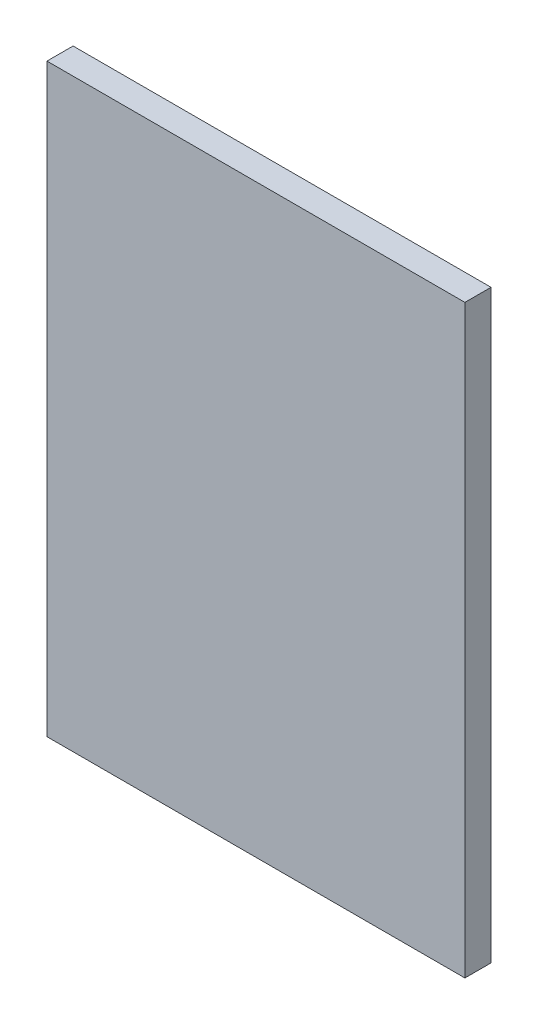
ISO-10303-21;
HEADER;
FILE_DESCRIPTION(('STEP AP214'),'2;1');
FILE_NAME('part.step','',(''),(''),'','','');
FILE_SCHEMA(('AUTOMOTIVE_DESIGN { 1 0 10303 214 1 1 1 1 }'));
ENDSEC;
DATA;
#1=APPLICATION_CONTEXT('core data for automotive mechanical design processes');
#2=APPLICATION_PROTOCOL_DEFINITION('international standard','automotive_design',2000,#1);
#3=PRODUCT_CONTEXT('',#1,'mechanical');
#4=PRODUCT('Part','Part','',(#3));
#5=PRODUCT_RELATED_PRODUCT_CATEGORY('part','',(#4));
#6=PRODUCT_DEFINITION_FORMATION('','',#4);
#7=PRODUCT_DEFINITION_CONTEXT('part definition',#1,'design');
#8=PRODUCT_DEFINITION('design','',#6,#7);
#9=PRODUCT_DEFINITION_SHAPE('','',#8);
#10=(LENGTH_UNIT() NAMED_UNIT(*) SI_UNIT(.MILLI.,.METRE.));
#11=(NAMED_UNIT(*) PLANE_ANGLE_UNIT() SI_UNIT($,.RADIAN.));
#12=(NAMED_UNIT(*) SI_UNIT($,.STERADIAN.) SOLID_ANGLE_UNIT());
#13=UNCERTAINTY_MEASURE_WITH_UNIT(LENGTH_MEASURE(1.E-05),#10,'distance_accuracy_value','');
#14=(GEOMETRIC_REPRESENTATION_CONTEXT(3) GLOBAL_UNCERTAINTY_ASSIGNED_CONTEXT((#13)) GLOBAL_UNIT_ASSIGNED_CONTEXT((#10,
#11,#12)) REPRESENTATION_CONTEXT('',''));
#15=CARTESIAN_POINT('',(0.,0.,0.));
#16=DIRECTION('',(0.,0.,1.));
#17=DIRECTION('',(1.,0.,0.));
#18=AXIS2_PLACEMENT_3D('',#15,#16,#17);
#19=CARTESIAN_POINT('',(-25.4,-35.56,3.175));
#20=DIRECTION('',(1.,0.,0.));
#21=DIRECTION('',(0.,0.,-1.));
#22=AXIS2_PLACEMENT_3D('',#19,#20,#21);
#23=PLANE('',#22);
#24=DIRECTION('',(0.,-1.,0.));
#25=VECTOR('',#24,1.);
#26=CARTESIAN_POINT('',(-25.4,-35.56,0.));
#27=LINE('',#26,#25);
#28=CARTESIAN_POINT('',(-25.4,35.56,0.));
#29=VERTEX_POINT('',#28);
#30=CARTESIAN_POINT('',(-25.4,-35.56,0.));
#31=VERTEX_POINT('',#30);
#32=EDGE_CURVE('E107',#29,#31,#27,.T.);
#33=ORIENTED_EDGE('',*,*,#32,.T.);
#34=DIRECTION('',(0.,0.,-1.));
#35=VECTOR('',#34,1.);
#36=CARTESIAN_POINT('',(-25.4,-35.56,3.175));
#37=LINE('',#36,#35);
#38=CARTESIAN_POINT('',(-25.4,-35.56,3.175));
#39=VERTEX_POINT('',#38);
#40=EDGE_CURVE('E11',#39,#31,#37,.T.);
#41=ORIENTED_EDGE('',*,*,#40,.F.);
#42=DIRECTION('',(0.,-1.,0.));
#43=VECTOR('',#42,1.);
#44=CARTESIAN_POINT('',(-25.4,-35.56,3.175));
#45=LINE('',#44,#43);
#46=CARTESIAN_POINT('',(-25.4,35.56,3.175));
#47=VERTEX_POINT('',#46);
#48=EDGE_CURVE('E91',#47,#39,#45,.T.);
#49=ORIENTED_EDGE('',*,*,#48,.F.);
#50=DIRECTION('',(0.,0.,-1.));
#51=VECTOR('',#50,1.);
#52=CARTESIAN_POINT('',(-25.4,35.56,3.175));
#53=LINE('',#52,#51);
#54=EDGE_CURVE('E103',#47,#29,#53,.T.);
#55=ORIENTED_EDGE('',*,*,#54,.T.);
#56=EDGE_LOOP('',(#33,#41,#49,#55));
#57=FACE_BOUND('',#56,.T.);
#58=ADVANCED_FACE('F39',(#57),#23,.F.);
#59=CARTESIAN_POINT('',(25.4,-35.56,3.175));
#60=DIRECTION('',(0.,1.,0.));
#61=DIRECTION('',(-1.,0.,0.));
#62=AXIS2_PLACEMENT_3D('',#59,#60,#61);
#63=PLANE('',#62);
#64=DIRECTION('',(1.,0.,0.));
#65=VECTOR('',#64,1.);
#66=CARTESIAN_POINT('',(25.4,-35.56,0.));
#67=LINE('',#66,#65);
#68=CARTESIAN_POINT('',(25.4,-35.56,0.));
#69=VERTEX_POINT('',#68);
#70=EDGE_CURVE('E96',#31,#69,#67,.T.);
#71=ORIENTED_EDGE('',*,*,#70,.T.);
#72=DIRECTION('',(0.,0.,-1.));
#73=VECTOR('',#72,1.);
#74=CARTESIAN_POINT('',(25.4,-35.56,3.175));
#75=LINE('',#74,#73);
#76=CARTESIAN_POINT('',(25.4,-35.56,3.175));
#77=VERTEX_POINT('',#76);
#78=EDGE_CURVE('E48',#77,#69,#75,.T.);
#79=ORIENTED_EDGE('',*,*,#78,.F.);
#80=DIRECTION('',(1.,0.,0.));
#81=VECTOR('',#80,1.);
#82=CARTESIAN_POINT('',(25.4,-35.56,3.175));
#83=LINE('',#82,#81);
#84=EDGE_CURVE('E86',#39,#77,#83,.T.);
#85=ORIENTED_EDGE('',*,*,#84,.F.);
#86=ORIENTED_EDGE('',*,*,#40,.T.);
#87=EDGE_LOOP('',(#71,#79,#85,#86));
#88=FACE_BOUND('',#87,.T.);
#89=ADVANCED_FACE('F95',(#88),#63,.F.);
#90=CARTESIAN_POINT('',(25.4,-35.56,3.175));
#91=DIRECTION('',(-1.,0.,0.));
#92=DIRECTION('',(0.,-1.,0.));
#93=AXIS2_PLACEMENT_3D('',#90,#91,#92);
#94=PLANE('',#93);
#95=DIRECTION('',(0.,1.,0.));
#96=VECTOR('',#95,1.);
#97=CARTESIAN_POINT('',(25.4,-35.56,0.));
#98=LINE('',#97,#96);
#99=CARTESIAN_POINT('',(25.4,35.56,0.));
#100=VERTEX_POINT('',#99);
#101=EDGE_CURVE('E73',#69,#100,#98,.T.);
#102=ORIENTED_EDGE('',*,*,#101,.T.);
#103=DIRECTION('',(0.,0.,-1.));
#104=VECTOR('',#103,1.);
#105=CARTESIAN_POINT('',(25.4,35.56,3.175));
#106=LINE('',#105,#104);
#107=CARTESIAN_POINT('',(25.4,35.56,3.175));
#108=VERTEX_POINT('',#107);
#109=EDGE_CURVE('E98',#108,#100,#106,.T.);
#110=ORIENTED_EDGE('',*,*,#109,.F.);
#111=DIRECTION('',(0.,1.,0.));
#112=VECTOR('',#111,1.);
#113=CARTESIAN_POINT('',(25.4,-35.56,3.175));
#114=LINE('',#113,#112);
#115=EDGE_CURVE('E89',#77,#108,#114,.T.);
#116=ORIENTED_EDGE('',*,*,#115,.F.);
#117=ORIENTED_EDGE('',*,*,#78,.T.);
#118=EDGE_LOOP('',(#102,#110,#116,#117));
#119=FACE_BOUND('',#118,.T.);
#120=ADVANCED_FACE('F99',(#119),#94,.F.);
#121=CARTESIAN_POINT('',(25.4,35.56,3.175));
#122=DIRECTION('',(0.,-1.,0.));
#123=DIRECTION('',(1.,0.,0.));
#124=AXIS2_PLACEMENT_3D('',#121,#122,#123);
#125=PLANE('',#124);
#126=DIRECTION('',(-1.,0.,0.));
#127=VECTOR('',#126,1.);
#128=CARTESIAN_POINT('',(25.4,35.56,0.));
#129=LINE('',#128,#127);
#130=EDGE_CURVE('E79',#100,#29,#129,.T.);
#131=ORIENTED_EDGE('',*,*,#130,.T.);
#132=ORIENTED_EDGE('',*,*,#54,.F.);
#133=DIRECTION('',(-1.,0.,0.));
#134=VECTOR('',#133,1.);
#135=CARTESIAN_POINT('',(25.4,35.56,3.175));
#136=LINE('',#135,#134);
#137=EDGE_CURVE('E56',#108,#47,#136,.T.);
#138=ORIENTED_EDGE('',*,*,#137,.F.);
#139=ORIENTED_EDGE('',*,*,#109,.T.);
#140=EDGE_LOOP('',(#131,#132,#138,#139));
#141=FACE_BOUND('',#140,.T.);
#142=ADVANCED_FACE('F120',(#141),#125,.F.);
#143=CARTESIAN_POINT('',(0.,0.,3.175));
#144=DIRECTION('',(0.,0.,1.));
#145=DIRECTION('',(1.,0.,0.));
#146=AXIS2_PLACEMENT_3D('',#143,#144,#145);
#147=PLANE('',#146);
#148=ORIENTED_EDGE('',*,*,#48,.T.);
#149=ORIENTED_EDGE('',*,*,#84,.T.);
#150=ORIENTED_EDGE('',*,*,#115,.T.);
#151=ORIENTED_EDGE('',*,*,#137,.T.);
#152=EDGE_LOOP('',(#148,#149,#150,#151));
#153=FACE_BOUND('',#152,.T.);
#154=ADVANCED_FACE('F87',(#153),#147,.T.);
#155=CARTESIAN_POINT('',(0.,0.,0.));
#156=DIRECTION('',(0.,0.,1.));
#157=DIRECTION('',(1.,0.,0.));
#158=AXIS2_PLACEMENT_3D('',#155,#156,#157);
#159=PLANE('',#158);
#160=ORIENTED_EDGE('',*,*,#32,.F.);
#161=ORIENTED_EDGE('',*,*,#130,.F.);
#162=ORIENTED_EDGE('',*,*,#101,.F.);
#163=ORIENTED_EDGE('',*,*,#70,.F.);
#164=EDGE_LOOP('',(#160,#161,#162,#163));
#165=FACE_BOUND('',#164,.T.);
#166=ADVANCED_FACE('F123',(#165),#159,.F.);
#167=CLOSED_SHELL('',(#58,#89,#120,#142,#154,#166));
#168=MANIFOLD_SOLID_BREP('B2',#167);
#169=ADVANCED_BREP_SHAPE_REPRESENTATION('',(#18,#168),#14);
#170=SHAPE_DEFINITION_REPRESENTATION(#9,#169);
ENDSEC;
END-ISO-10303-21;
